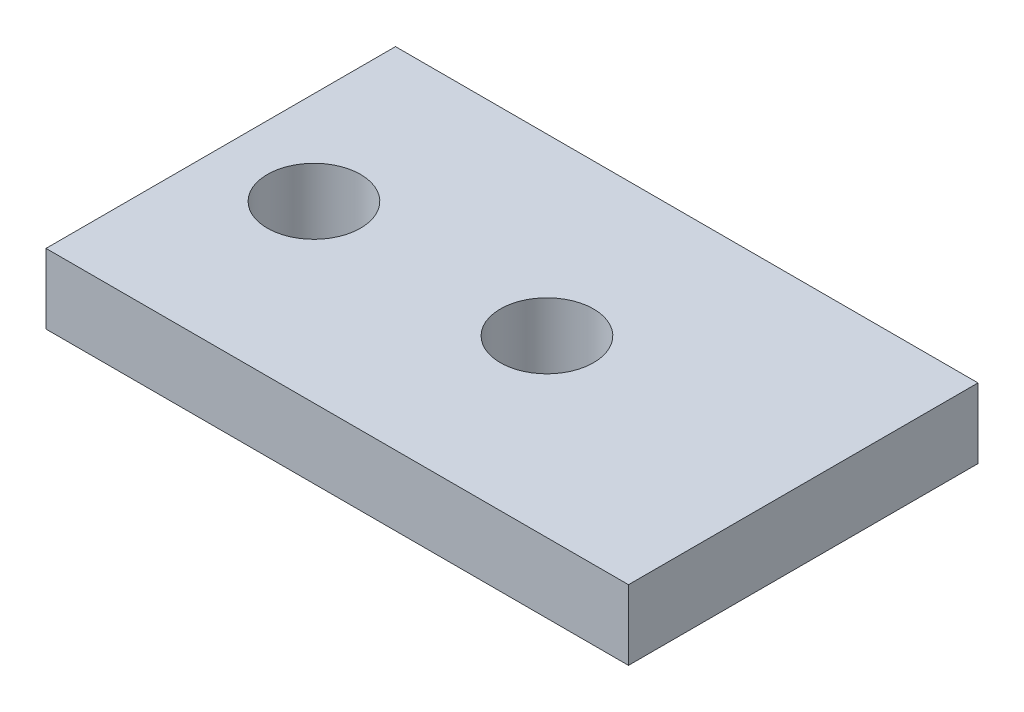
ISO-10303-21;
HEADER;
FILE_DESCRIPTION(('STEP AP214'),'2;1');
FILE_NAME('part.step','',(''),(''),'','','');
FILE_SCHEMA(('AUTOMOTIVE_DESIGN { 1 0 10303 214 1 1 1 1 }'));
ENDSEC;
DATA;
#1=APPLICATION_CONTEXT('core data for automotive mechanical design processes');
#2=APPLICATION_PROTOCOL_DEFINITION('international standard','automotive_design',2000,#1);
#3=PRODUCT_CONTEXT('',#1,'mechanical');
#4=PRODUCT('Part','Part','',(#3));
#5=PRODUCT_RELATED_PRODUCT_CATEGORY('part','',(#4));
#6=PRODUCT_DEFINITION_FORMATION('','',#4);
#7=PRODUCT_DEFINITION_CONTEXT('part definition',#1,'design');
#8=PRODUCT_DEFINITION('design','',#6,#7);
#9=PRODUCT_DEFINITION_SHAPE('','',#8);
#10=(LENGTH_UNIT() NAMED_UNIT(*) SI_UNIT(.MILLI.,.METRE.));
#11=(NAMED_UNIT(*) PLANE_ANGLE_UNIT() SI_UNIT($,.RADIAN.));
#12=(NAMED_UNIT(*) SI_UNIT($,.STERADIAN.) SOLID_ANGLE_UNIT());
#13=UNCERTAINTY_MEASURE_WITH_UNIT(LENGTH_MEASURE(1.E-05),#10,'distance_accuracy_value','');
#14=(GEOMETRIC_REPRESENTATION_CONTEXT(3) GLOBAL_UNCERTAINTY_ASSIGNED_CONTEXT((#13)) GLOBAL_UNIT_ASSIGNED_CONTEXT((#10,
#11,#12)) REPRESENTATION_CONTEXT('',''));
#15=CARTESIAN_POINT('',(0.,0.,0.));
#16=DIRECTION('',(0.,0.,1.));
#17=DIRECTION('',(1.,0.,0.));
#18=AXIS2_PLACEMENT_3D('',#15,#16,#17);
#19=CARTESIAN_POINT('',(-25.,6.00000000000001,-14.9999999999985));
#20=DIRECTION('',(0.,1.,0.));
#21=DIRECTION('',(0.,0.,-1.));
#22=AXIS2_PLACEMENT_3D('',#19,#20,#21);
#23=PLANE('',#22);
#24=CARTESIAN_POINT('',(3.,6.00000000000001,1.55431223447522E-12));
#25=DIRECTION('',(0.,-1.,0.));
#26=DIRECTION('',(0.,0.,-1.));
#27=AXIS2_PLACEMENT_3D('',#24,#25,#26);
#28=CIRCLE('',#27,4.);
#29=CARTESIAN_POINT('',(3.,6.00000000000001,-3.99999999999844));
#30=VERTEX_POINT('',#29);
#31=EDGE_CURVE('E103',#30,#30,#28,.T.);
#32=ORIENTED_EDGE('',*,*,#31,.T.);
#33=EDGE_LOOP('',(#32));
#34=FACE_BOUND('',#33,.T.);
#35=DIRECTION('',(0.,0.,-1.));
#36=VECTOR('',#35,1.);
#37=CARTESIAN_POINT('',(-25.,6.00000000000001,15.0000000000016));
#38=LINE('',#37,#36);
#39=CARTESIAN_POINT('',(-25.,6.00000000000001,15.0000000000016));
#40=VERTEX_POINT('',#39);
#41=CARTESIAN_POINT('',(-25.,6.00000000000001,-14.9999999999985));
#42=VERTEX_POINT('',#41);
#43=EDGE_CURVE('E91',#40,#42,#38,.T.);
#44=ORIENTED_EDGE('',*,*,#43,.F.);
#45=DIRECTION('',(-1.,0.,0.));
#46=VECTOR('',#45,1.);
#47=CARTESIAN_POINT('',(-25.,6.00000000000001,15.0000000000016));
#48=LINE('',#47,#46);
#49=CARTESIAN_POINT('',(25.,6.00000000000001,15.));
#50=VERTEX_POINT('',#49);
#51=EDGE_CURVE('E94',#50,#40,#48,.T.);
#52=ORIENTED_EDGE('',*,*,#51,.F.);
#53=DIRECTION('',(0.,0.,1.));
#54=VECTOR('',#53,1.);
#55=CARTESIAN_POINT('',(25.,6.00000000000001,15.));
#56=LINE('',#55,#54);
#57=CARTESIAN_POINT('',(25.,6.00000000000001,-15.));
#58=VERTEX_POINT('',#57);
#59=EDGE_CURVE('E82',#58,#50,#56,.T.);
#60=ORIENTED_EDGE('',*,*,#59,.F.);
#61=DIRECTION('',(1.,0.,0.));
#62=VECTOR('',#61,1.);
#63=CARTESIAN_POINT('',(-25.,6.00000000000001,-14.9999999999985));
#64=LINE('',#63,#62);
#65=EDGE_CURVE('E87',#42,#58,#64,.T.);
#66=ORIENTED_EDGE('',*,*,#65,.F.);
#67=EDGE_LOOP('',(#44,#52,#60,#66));
#68=FACE_BOUND('',#67,.T.);
#69=CARTESIAN_POINT('',(-17.,6.00000000000001,1.55431223447522E-12));
#70=DIRECTION('',(0.,-1.,0.));
#71=DIRECTION('',(0.,0.,-1.));
#72=AXIS2_PLACEMENT_3D('',#69,#70,#71);
#73=CIRCLE('',#72,4.);
#74=CARTESIAN_POINT('',(-17.,6.00000000000001,-3.99999999999845));
#75=VERTEX_POINT('',#74);
#76=EDGE_CURVE('E114',#75,#75,#73,.T.);
#77=ORIENTED_EDGE('',*,*,#76,.T.);
#78=EDGE_LOOP('',(#77));
#79=FACE_BOUND('',#78,.T.);
#80=ADVANCED_FACE('F35',(#34,#68,#79),#23,.T.);
#81=CARTESIAN_POINT('',(-25.,0.,-14.9999999999985));
#82=DIRECTION('',(0.,1.,0.));
#83=DIRECTION('',(0.,0.,-1.));
#84=AXIS2_PLACEMENT_3D('',#81,#82,#83);
#85=PLANE('',#84);
#86=CARTESIAN_POINT('',(3.,0.,1.55431223447522E-12));
#87=DIRECTION('',(0.,-1.,0.));
#88=DIRECTION('',(0.,0.,-1.));
#89=AXIS2_PLACEMENT_3D('',#86,#87,#88);
#90=CIRCLE('',#89,4.);
#91=CARTESIAN_POINT('',(3.,0.,-3.99999999999844));
#92=VERTEX_POINT('',#91);
#93=EDGE_CURVE('E111',#92,#92,#90,.T.);
#94=ORIENTED_EDGE('',*,*,#93,.F.);
#95=EDGE_LOOP('',(#94));
#96=FACE_BOUND('',#95,.T.);
#97=DIRECTION('',(0.,0.,-1.));
#98=VECTOR('',#97,1.);
#99=CARTESIAN_POINT('',(-25.,0.,15.0000000000016));
#100=LINE('',#99,#98);
#101=CARTESIAN_POINT('',(-25.,0.,15.0000000000016));
#102=VERTEX_POINT('',#101);
#103=CARTESIAN_POINT('',(-25.,0.,-14.9999999999985));
#104=VERTEX_POINT('',#103);
#105=EDGE_CURVE('E99',#102,#104,#100,.T.);
#106=ORIENTED_EDGE('',*,*,#105,.T.);
#107=DIRECTION('',(1.,0.,0.));
#108=VECTOR('',#107,1.);
#109=CARTESIAN_POINT('',(-25.,0.,-14.9999999999985));
#110=LINE('',#109,#108);
#111=CARTESIAN_POINT('',(25.,0.,-15.));
#112=VERTEX_POINT('',#111);
#113=EDGE_CURVE('E102',#104,#112,#110,.T.);
#114=ORIENTED_EDGE('',*,*,#113,.T.);
#115=DIRECTION('',(0.,0.,1.));
#116=VECTOR('',#115,1.);
#117=CARTESIAN_POINT('',(25.,0.,15.));
#118=LINE('',#117,#116);
#119=CARTESIAN_POINT('',(25.,0.,15.));
#120=VERTEX_POINT('',#119);
#121=EDGE_CURVE('E85',#112,#120,#118,.T.);
#122=ORIENTED_EDGE('',*,*,#121,.T.);
#123=DIRECTION('',(-1.,0.,0.));
#124=VECTOR('',#123,1.);
#125=CARTESIAN_POINT('',(-25.,0.,15.0000000000016));
#126=LINE('',#125,#124);
#127=EDGE_CURVE('E106',#120,#102,#126,.T.);
#128=ORIENTED_EDGE('',*,*,#127,.T.);
#129=EDGE_LOOP('',(#106,#114,#122,#128));
#130=FACE_BOUND('',#129,.T.);
#131=CARTESIAN_POINT('',(-17.,0.,1.55431223447522E-12));
#132=DIRECTION('',(0.,-1.,0.));
#133=DIRECTION('',(0.,0.,-1.));
#134=AXIS2_PLACEMENT_3D('',#131,#132,#133);
#135=CIRCLE('',#134,4.);
#136=CARTESIAN_POINT('',(-17.,0.,-3.99999999999845));
#137=VERTEX_POINT('',#136);
#138=EDGE_CURVE('E117',#137,#137,#135,.T.);
#139=ORIENTED_EDGE('',*,*,#138,.F.);
#140=EDGE_LOOP('',(#139));
#141=FACE_BOUND('',#140,.T.);
#142=ADVANCED_FACE('F130',(#96,#130,#141),#85,.F.);
#143=CARTESIAN_POINT('',(-25.,6.00000000000001,15.0000000000016));
#144=DIRECTION('',(1.,0.,0.));
#145=DIRECTION('',(0.,0.,1.));
#146=AXIS2_PLACEMENT_3D('',#143,#144,#145);
#147=PLANE('',#146);
#148=ORIENTED_EDGE('',*,*,#105,.F.);
#149=DIRECTION('',(0.,-1.,0.));
#150=VECTOR('',#149,1.);
#151=CARTESIAN_POINT('',(-25.,6.00000000000001,15.0000000000016));
#152=LINE('',#151,#150);
#153=EDGE_CURVE('E52',#40,#102,#152,.T.);
#154=ORIENTED_EDGE('',*,*,#153,.F.);
#155=ORIENTED_EDGE('',*,*,#43,.T.);
#156=DIRECTION('',(0.,-1.,0.));
#157=VECTOR('',#156,1.);
#158=CARTESIAN_POINT('',(-25.,6.00000000000001,-14.9999999999985));
#159=LINE('',#158,#157);
#160=EDGE_CURVE('E11',#42,#104,#159,.T.);
#161=ORIENTED_EDGE('',*,*,#160,.T.);
#162=EDGE_LOOP('',(#148,#154,#155,#161));
#163=FACE_BOUND('',#162,.T.);
#164=ADVANCED_FACE('F37',(#163),#147,.F.);
#165=CARTESIAN_POINT('',(-25.,6.00000000000001,-14.9999999999985));
#166=DIRECTION('',(0.,0.,1.));
#167=DIRECTION('',(-1.,0.,0.));
#168=AXIS2_PLACEMENT_3D('',#165,#166,#167);
#169=PLANE('',#168);
#170=ORIENTED_EDGE('',*,*,#113,.F.);
#171=ORIENTED_EDGE('',*,*,#160,.F.);
#172=ORIENTED_EDGE('',*,*,#65,.T.);
#173=DIRECTION('',(0.,-1.,0.));
#174=VECTOR('',#173,1.);
#175=CARTESIAN_POINT('',(25.,6.00000000000001,-15.));
#176=LINE('',#175,#174);
#177=EDGE_CURVE('E44',#58,#112,#176,.T.);
#178=ORIENTED_EDGE('',*,*,#177,.T.);
#179=EDGE_LOOP('',(#170,#171,#172,#178));
#180=FACE_BOUND('',#179,.T.);
#181=ADVANCED_FACE('F88',(#180),#169,.F.);
#182=CARTESIAN_POINT('',(25.,6.00000000000001,15.));
#183=DIRECTION('',(-1.,0.,0.));
#184=DIRECTION('',(0.,0.,-1.));
#185=AXIS2_PLACEMENT_3D('',#182,#183,#184);
#186=PLANE('',#185);
#187=ORIENTED_EDGE('',*,*,#121,.F.);
#188=ORIENTED_EDGE('',*,*,#177,.F.);
#189=ORIENTED_EDGE('',*,*,#59,.T.);
#190=DIRECTION('',(0.,-1.,0.));
#191=VECTOR('',#190,1.);
#192=CARTESIAN_POINT('',(25.,6.00000000000001,15.));
#193=LINE('',#192,#191);
#194=EDGE_CURVE('E68',#50,#120,#193,.T.);
#195=ORIENTED_EDGE('',*,*,#194,.T.);
#196=EDGE_LOOP('',(#187,#188,#189,#195));
#197=FACE_BOUND('',#196,.T.);
#198=ADVANCED_FACE('F80',(#197),#186,.F.);
#199=CARTESIAN_POINT('',(-25.,6.00000000000001,15.0000000000016));
#200=DIRECTION('',(0.,0.,-1.));
#201=DIRECTION('',(1.,0.,0.));
#202=AXIS2_PLACEMENT_3D('',#199,#200,#201);
#203=PLANE('',#202);
#204=ORIENTED_EDGE('',*,*,#127,.F.);
#205=ORIENTED_EDGE('',*,*,#194,.F.);
#206=ORIENTED_EDGE('',*,*,#51,.T.);
#207=ORIENTED_EDGE('',*,*,#153,.T.);
#208=EDGE_LOOP('',(#204,#205,#206,#207));
#209=FACE_BOUND('',#208,.T.);
#210=ADVANCED_FACE('F143',(#209),#203,.F.);
#211=CARTESIAN_POINT('',(3.,6.00000000000001,1.55431223447522E-12));
#212=DIRECTION('',(0.,-1.,0.));
#213=DIRECTION('',(0.,0.,1.));
#214=AXIS2_PLACEMENT_3D('',#211,#212,#213);
#215=CYLINDRICAL_SURFACE('',#214,4.);
#216=ORIENTED_EDGE('',*,*,#31,.F.);
#217=EDGE_LOOP('',(#216));
#218=FACE_BOUND('',#217,.T.);
#219=ORIENTED_EDGE('',*,*,#93,.T.);
#220=EDGE_LOOP('',(#219));
#221=FACE_BOUND('',#220,.T.);
#222=ADVANCED_FACE('F126',(#218,#221),#215,.F.);
#223=CARTESIAN_POINT('',(-17.,6.00000000000001,1.55431223447522E-12));
#224=DIRECTION('',(0.,-1.,0.));
#225=DIRECTION('',(0.,0.,1.));
#226=AXIS2_PLACEMENT_3D('',#223,#224,#225);
#227=CYLINDRICAL_SURFACE('',#226,4.);
#228=ORIENTED_EDGE('',*,*,#76,.F.);
#229=EDGE_LOOP('',(#228));
#230=FACE_BOUND('',#229,.T.);
#231=ORIENTED_EDGE('',*,*,#138,.T.);
#232=EDGE_LOOP('',(#231));
#233=FACE_BOUND('',#232,.T.);
#234=ADVANCED_FACE('F123',(#230,#233),#227,.F.);
#235=CLOSED_SHELL('',(#80,#142,#164,#181,#198,#210,#222,#234));
#236=MANIFOLD_SOLID_BREP('B2',#235);
#237=ADVANCED_BREP_SHAPE_REPRESENTATION('',(#18,#236),#14);
#238=SHAPE_DEFINITION_REPRESENTATION(#9,#237);
ENDSEC;
END-ISO-10303-21;
